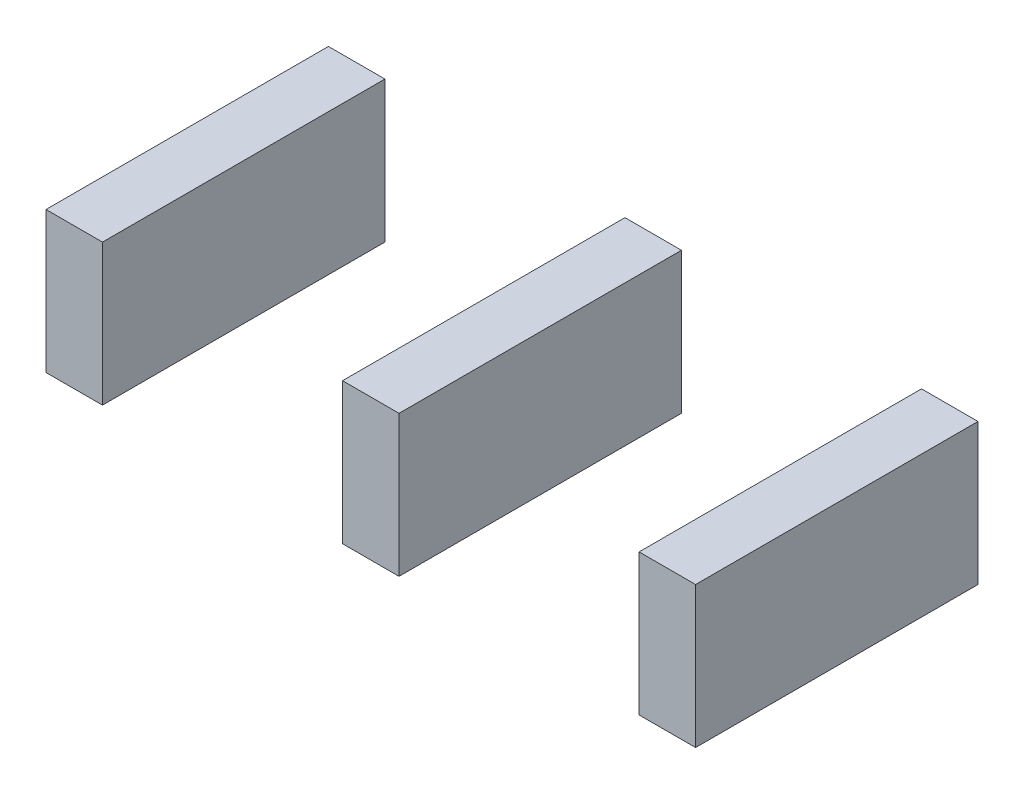
ISO-10303-21;
HEADER;
FILE_DESCRIPTION(('STEP AP214'),'2;1');
FILE_NAME('part.step','',(''),(''),'','','');
FILE_SCHEMA(('AUTOMOTIVE_DESIGN { 1 0 10303 214 1 1 1 1 }'));
ENDSEC;
DATA;
#1=APPLICATION_CONTEXT('core data for automotive mechanical design processes');
#2=APPLICATION_PROTOCOL_DEFINITION('international standard','automotive_design',2000,#1);
#3=PRODUCT_CONTEXT('',#1,'mechanical');
#4=PRODUCT('Part','Part','',(#3));
#5=PRODUCT_RELATED_PRODUCT_CATEGORY('part','',(#4));
#6=PRODUCT_DEFINITION_FORMATION('','',#4);
#7=PRODUCT_DEFINITION_CONTEXT('part definition',#1,'design');
#8=PRODUCT_DEFINITION('design','',#6,#7);
#9=PRODUCT_DEFINITION_SHAPE('','',#8);
#10=(LENGTH_UNIT() NAMED_UNIT(*) SI_UNIT(.MILLI.,.METRE.));
#11=(NAMED_UNIT(*) PLANE_ANGLE_UNIT() SI_UNIT($,.RADIAN.));
#12=(NAMED_UNIT(*) SI_UNIT($,.STERADIAN.) SOLID_ANGLE_UNIT());
#13=UNCERTAINTY_MEASURE_WITH_UNIT(LENGTH_MEASURE(1.E-05),#10,'distance_accuracy_value','');
#14=(GEOMETRIC_REPRESENTATION_CONTEXT(3) GLOBAL_UNCERTAINTY_ASSIGNED_CONTEXT((#13)) GLOBAL_UNIT_ASSIGNED_CONTEXT((#10,
#11,#12)) REPRESENTATION_CONTEXT('',''));
#15=CARTESIAN_POINT('',(0.,0.,0.));
#16=DIRECTION('',(0.,0.,1.));
#17=DIRECTION('',(1.,0.,0.));
#18=AXIS2_PLACEMENT_3D('',#15,#16,#17);
#19=CARTESIAN_POINT('',(3.8,1.,4.));
#20=DIRECTION('',(0.,-1.,0.));
#21=DIRECTION('',(0.,0.,-1.));
#22=AXIS2_PLACEMENT_3D('',#19,#20,#21);
#23=PLANE('',#22);
#24=DIRECTION('',(-1.,0.,0.));
#25=VECTOR('',#24,1.);
#26=CARTESIAN_POINT('',(3.8,1.,0.));
#27=LINE('',#26,#25);
#28=CARTESIAN_POINT('',(4.6,1.,0.));
#29=VERTEX_POINT('',#28);
#30=CARTESIAN_POINT('',(3.8,1.,0.));
#31=VERTEX_POINT('',#30);
#32=EDGE_CURVE('E107',#29,#31,#27,.T.);
#33=ORIENTED_EDGE('',*,*,#32,.T.);
#34=DIRECTION('',(0.,0.,-1.));
#35=VECTOR('',#34,1.);
#36=CARTESIAN_POINT('',(3.8,1.,4.));
#37=LINE('',#36,#35);
#38=CARTESIAN_POINT('',(3.8,1.,4.));
#39=VERTEX_POINT('',#38);
#40=EDGE_CURVE('E12',#39,#31,#37,.T.);
#41=ORIENTED_EDGE('',*,*,#40,.F.);
#42=DIRECTION('',(-1.,0.,0.));
#43=VECTOR('',#42,1.);
#44=CARTESIAN_POINT('',(3.8,1.,4.));
#45=LINE('',#44,#43);
#46=CARTESIAN_POINT('',(4.6,1.,4.));
#47=VERTEX_POINT('',#46);
#48=EDGE_CURVE('E95',#47,#39,#45,.T.);
#49=ORIENTED_EDGE('',*,*,#48,.F.);
#50=DIRECTION('',(0.,0.,-1.));
#51=VECTOR('',#50,1.);
#52=CARTESIAN_POINT('',(4.6,1.,4.));
#53=LINE('',#52,#51);
#54=EDGE_CURVE('E103',#47,#29,#53,.T.);
#55=ORIENTED_EDGE('',*,*,#54,.T.);
#56=EDGE_LOOP('',(#33,#41,#49,#55));
#57=FACE_BOUND('',#56,.T.);
#58=ADVANCED_FACE('F44',(#57),#23,.F.);
#59=CARTESIAN_POINT('',(3.8,1.,4.));
#60=DIRECTION('',(1.,0.,0.));
#61=DIRECTION('',(0.,1.,0.));
#62=AXIS2_PLACEMENT_3D('',#59,#60,#61);
#63=PLANE('',#62);
#64=DIRECTION('',(0.,-1.,0.));
#65=VECTOR('',#64,1.);
#66=CARTESIAN_POINT('',(3.8,1.,0.));
#67=LINE('',#66,#65);
#68=CARTESIAN_POINT('',(3.8,-1.,0.));
#69=VERTEX_POINT('',#68);
#70=EDGE_CURVE('E99',#31,#69,#67,.T.);
#71=ORIENTED_EDGE('',*,*,#70,.T.);
#72=DIRECTION('',(0.,0.,-1.));
#73=VECTOR('',#72,1.);
#74=CARTESIAN_POINT('',(3.8,-1.,4.));
#75=LINE('',#74,#73);
#76=CARTESIAN_POINT('',(3.8,-1.,4.));
#77=VERTEX_POINT('',#76);
#78=EDGE_CURVE('E52',#77,#69,#75,.T.);
#79=ORIENTED_EDGE('',*,*,#78,.F.);
#80=DIRECTION('',(0.,-1.,0.));
#81=VECTOR('',#80,1.);
#82=CARTESIAN_POINT('',(3.8,1.,4.));
#83=LINE('',#82,#81);
#84=EDGE_CURVE('E90',#39,#77,#83,.T.);
#85=ORIENTED_EDGE('',*,*,#84,.F.);
#86=ORIENTED_EDGE('',*,*,#40,.T.);
#87=EDGE_LOOP('',(#71,#79,#85,#86));
#88=FACE_BOUND('',#87,.T.);
#89=ADVANCED_FACE('F98',(#88),#63,.F.);
#90=CARTESIAN_POINT('',(3.8,-1.,4.));
#91=DIRECTION('',(0.,1.,0.));
#92=DIRECTION('',(0.,0.,1.));
#93=AXIS2_PLACEMENT_3D('',#90,#91,#92);
#94=PLANE('',#93);
#95=DIRECTION('',(1.,0.,0.));
#96=VECTOR('',#95,1.);
#97=CARTESIAN_POINT('',(3.8,-1.,0.));
#98=LINE('',#97,#96);
#99=CARTESIAN_POINT('',(4.6,-1.,0.));
#100=VERTEX_POINT('',#99);
#101=EDGE_CURVE('E77',#69,#100,#98,.T.);
#102=ORIENTED_EDGE('',*,*,#101,.T.);
#103=DIRECTION('',(0.,0.,-1.));
#104=VECTOR('',#103,1.);
#105=CARTESIAN_POINT('',(4.6,-1.,4.));
#106=LINE('',#105,#104);
#107=CARTESIAN_POINT('',(4.6,-1.,4.));
#108=VERTEX_POINT('',#107);
#109=EDGE_CURVE('E100',#108,#100,#106,.T.);
#110=ORIENTED_EDGE('',*,*,#109,.F.);
#111=DIRECTION('',(1.,0.,0.));
#112=VECTOR('',#111,1.);
#113=CARTESIAN_POINT('',(3.8,-1.,4.));
#114=LINE('',#113,#112);
#115=EDGE_CURVE('E93',#77,#108,#114,.T.);
#116=ORIENTED_EDGE('',*,*,#115,.F.);
#117=ORIENTED_EDGE('',*,*,#78,.T.);
#118=EDGE_LOOP('',(#102,#110,#116,#117));
#119=FACE_BOUND('',#118,.T.);
#120=ADVANCED_FACE('F101',(#119),#94,.F.);
#121=CARTESIAN_POINT('',(4.6,1.,4.));
#122=DIRECTION('',(-1.,0.,0.));
#123=DIRECTION('',(0.,-1.,0.));
#124=AXIS2_PLACEMENT_3D('',#121,#122,#123);
#125=PLANE('',#124);
#126=DIRECTION('',(0.,1.,0.));
#127=VECTOR('',#126,1.);
#128=CARTESIAN_POINT('',(4.6,1.,0.));
#129=LINE('',#128,#127);
#130=EDGE_CURVE('E83',#100,#29,#129,.T.);
#131=ORIENTED_EDGE('',*,*,#130,.T.);
#132=ORIENTED_EDGE('',*,*,#54,.F.);
#133=DIRECTION('',(0.,1.,0.));
#134=VECTOR('',#133,1.);
#135=CARTESIAN_POINT('',(4.6,1.,4.));
#136=LINE('',#135,#134);
#137=EDGE_CURVE('E60',#108,#47,#136,.T.);
#138=ORIENTED_EDGE('',*,*,#137,.F.);
#139=ORIENTED_EDGE('',*,*,#109,.T.);
#140=EDGE_LOOP('',(#131,#132,#138,#139));
#141=FACE_BOUND('',#140,.T.);
#142=ADVANCED_FACE('F114',(#141),#125,.F.);
#143=CARTESIAN_POINT('',(0.,0.,4.));
#144=DIRECTION('',(0.,0.,-1.));
#145=DIRECTION('',(-1.,0.,0.));
#146=AXIS2_PLACEMENT_3D('',#143,#144,#145);
#147=PLANE('',#146);
#148=ORIENTED_EDGE('',*,*,#48,.T.);
#149=ORIENTED_EDGE('',*,*,#84,.T.);
#150=ORIENTED_EDGE('',*,*,#115,.T.);
#151=ORIENTED_EDGE('',*,*,#137,.T.);
#152=EDGE_LOOP('',(#148,#149,#150,#151));
#153=FACE_BOUND('',#152,.T.);
#154=ADVANCED_FACE('F91',(#153),#147,.F.);
#155=CARTESIAN_POINT('',(0.,0.,0.));
#156=DIRECTION('',(0.,0.,-1.));
#157=DIRECTION('',(-1.,0.,0.));
#158=AXIS2_PLACEMENT_3D('',#155,#156,#157);
#159=PLANE('',#158);
#160=ORIENTED_EDGE('',*,*,#32,.F.);
#161=ORIENTED_EDGE('',*,*,#130,.F.);
#162=ORIENTED_EDGE('',*,*,#101,.F.);
#163=ORIENTED_EDGE('',*,*,#70,.F.);
#164=EDGE_LOOP('',(#160,#161,#162,#163));
#165=FACE_BOUND('',#164,.T.);
#166=ADVANCED_FACE('F117',(#165),#159,.T.);
#167=CLOSED_SHELL('',(#58,#89,#120,#142,#154,#166));
#168=MANIFOLD_SOLID_BREP('B2',#167);
#169=CARTESIAN_POINT('',(-4.6,0.999999999999971,4.));
#170=DIRECTION('',(0.,-1.,0.));
#171=DIRECTION('',(0.,0.,-1.));
#172=AXIS2_PLACEMENT_3D('',#169,#170,#171);
#173=PLANE('',#172);
#174=DIRECTION('',(-1.,0.,0.));
#175=VECTOR('',#174,1.);
#176=CARTESIAN_POINT('',(-4.6,0.999999999999971,0.));
#177=LINE('',#176,#175);
#178=CARTESIAN_POINT('',(-3.8,0.999999999999971,0.));
#179=VERTEX_POINT('',#178);
#180=CARTESIAN_POINT('',(-4.6,0.999999999999971,0.));
#181=VERTEX_POINT('',#180);
#182=EDGE_CURVE('E240',#179,#181,#177,.T.);
#183=ORIENTED_EDGE('',*,*,#182,.T.);
#184=DIRECTION('',(0.,0.,-1.));
#185=VECTOR('',#184,1.);
#186=CARTESIAN_POINT('',(-4.6,0.999999999999971,4.));
#187=LINE('',#186,#185);
#188=CARTESIAN_POINT('',(-4.6,0.999999999999971,4.));
#189=VERTEX_POINT('',#188);
#190=EDGE_CURVE('E42',#189,#181,#187,.T.);
#191=ORIENTED_EDGE('',*,*,#190,.F.);
#192=DIRECTION('',(-1.,0.,0.));
#193=VECTOR('',#192,1.);
#194=CARTESIAN_POINT('',(-4.6,0.999999999999971,4.));
#195=LINE('',#194,#193);
#196=CARTESIAN_POINT('',(-3.8,0.999999999999971,4.));
#197=VERTEX_POINT('',#196);
#198=EDGE_CURVE('E228',#197,#189,#195,.T.);
#199=ORIENTED_EDGE('',*,*,#198,.F.);
#200=DIRECTION('',(0.,0.,-1.));
#201=VECTOR('',#200,1.);
#202=CARTESIAN_POINT('',(-3.8,0.999999999999971,4.));
#203=LINE('',#202,#201);
#204=EDGE_CURVE('E236',#197,#179,#203,.T.);
#205=ORIENTED_EDGE('',*,*,#204,.T.);
#206=EDGE_LOOP('',(#183,#191,#199,#205));
#207=FACE_BOUND('',#206,.T.);
#208=ADVANCED_FACE('F177',(#207),#173,.F.);
#209=CARTESIAN_POINT('',(-4.6,0.999999999999971,4.));
#210=DIRECTION('',(1.,0.,0.));
#211=DIRECTION('',(0.,1.,0.));
#212=AXIS2_PLACEMENT_3D('',#209,#210,#211);
#213=PLANE('',#212);
#214=DIRECTION('',(0.,-1.,0.));
#215=VECTOR('',#214,1.);
#216=CARTESIAN_POINT('',(-4.6,0.999999999999971,0.));
#217=LINE('',#216,#215);
#218=CARTESIAN_POINT('',(-4.6,-1.00000000000003,0.));
#219=VERTEX_POINT('',#218);
#220=EDGE_CURVE('E232',#181,#219,#217,.T.);
#221=ORIENTED_EDGE('',*,*,#220,.T.);
#222=DIRECTION('',(0.,0.,-1.));
#223=VECTOR('',#222,1.);
#224=CARTESIAN_POINT('',(-4.6,-1.00000000000003,4.));
#225=LINE('',#224,#223);
#226=CARTESIAN_POINT('',(-4.6,-1.00000000000003,4.));
#227=VERTEX_POINT('',#226);
#228=EDGE_CURVE('E185',#227,#219,#225,.T.);
#229=ORIENTED_EDGE('',*,*,#228,.F.);
#230=DIRECTION('',(0.,-1.,0.));
#231=VECTOR('',#230,1.);
#232=CARTESIAN_POINT('',(-4.6,0.999999999999971,4.));
#233=LINE('',#232,#231);
#234=EDGE_CURVE('E223',#189,#227,#233,.T.);
#235=ORIENTED_EDGE('',*,*,#234,.F.);
#236=ORIENTED_EDGE('',*,*,#190,.T.);
#237=EDGE_LOOP('',(#221,#229,#235,#236));
#238=FACE_BOUND('',#237,.T.);
#239=ADVANCED_FACE('F231',(#238),#213,.F.);
#240=CARTESIAN_POINT('',(-4.6,-1.00000000000003,4.));
#241=DIRECTION('',(0.,1.,0.));
#242=DIRECTION('',(0.,0.,1.));
#243=AXIS2_PLACEMENT_3D('',#240,#241,#242);
#244=PLANE('',#243);
#245=DIRECTION('',(1.,0.,0.));
#246=VECTOR('',#245,1.);
#247=CARTESIAN_POINT('',(-4.6,-1.00000000000003,0.));
#248=LINE('',#247,#246);
#249=CARTESIAN_POINT('',(-3.8,-1.00000000000003,0.));
#250=VERTEX_POINT('',#249);
#251=EDGE_CURVE('E210',#219,#250,#248,.T.);
#252=ORIENTED_EDGE('',*,*,#251,.T.);
#253=DIRECTION('',(0.,0.,-1.));
#254=VECTOR('',#253,1.);
#255=CARTESIAN_POINT('',(-3.8,-1.00000000000003,4.));
#256=LINE('',#255,#254);
#257=CARTESIAN_POINT('',(-3.8,-1.00000000000003,4.));
#258=VERTEX_POINT('',#257);
#259=EDGE_CURVE('E233',#258,#250,#256,.T.);
#260=ORIENTED_EDGE('',*,*,#259,.F.);
#261=DIRECTION('',(1.,0.,0.));
#262=VECTOR('',#261,1.);
#263=CARTESIAN_POINT('',(-4.6,-1.00000000000003,4.));
#264=LINE('',#263,#262);
#265=EDGE_CURVE('E226',#227,#258,#264,.T.);
#266=ORIENTED_EDGE('',*,*,#265,.F.);
#267=ORIENTED_EDGE('',*,*,#228,.T.);
#268=EDGE_LOOP('',(#252,#260,#266,#267));
#269=FACE_BOUND('',#268,.T.);
#270=ADVANCED_FACE('F234',(#269),#244,.F.);
#271=CARTESIAN_POINT('',(-3.8,0.999999999999971,4.));
#272=DIRECTION('',(-1.,0.,0.));
#273=DIRECTION('',(0.,-1.,0.));
#274=AXIS2_PLACEMENT_3D('',#271,#272,#273);
#275=PLANE('',#274);
#276=DIRECTION('',(0.,1.,0.));
#277=VECTOR('',#276,1.);
#278=CARTESIAN_POINT('',(-3.8,0.999999999999971,0.));
#279=LINE('',#278,#277);
#280=EDGE_CURVE('E216',#250,#179,#279,.T.);
#281=ORIENTED_EDGE('',*,*,#280,.T.);
#282=ORIENTED_EDGE('',*,*,#204,.F.);
#283=DIRECTION('',(0.,1.,0.));
#284=VECTOR('',#283,1.);
#285=CARTESIAN_POINT('',(-3.8,0.999999999999971,4.));
#286=LINE('',#285,#284);
#287=EDGE_CURVE('E193',#258,#197,#286,.T.);
#288=ORIENTED_EDGE('',*,*,#287,.F.);
#289=ORIENTED_EDGE('',*,*,#259,.T.);
#290=EDGE_LOOP('',(#281,#282,#288,#289));
#291=FACE_BOUND('',#290,.T.);
#292=ADVANCED_FACE('F247',(#291),#275,.F.);
#293=CARTESIAN_POINT('',(0.,0.,4.));
#294=DIRECTION('',(0.,0.,-1.));
#295=DIRECTION('',(-1.,0.,0.));
#296=AXIS2_PLACEMENT_3D('',#293,#294,#295);
#297=PLANE('',#296);
#298=ORIENTED_EDGE('',*,*,#198,.T.);
#299=ORIENTED_EDGE('',*,*,#234,.T.);
#300=ORIENTED_EDGE('',*,*,#265,.T.);
#301=ORIENTED_EDGE('',*,*,#287,.T.);
#302=EDGE_LOOP('',(#298,#299,#300,#301));
#303=FACE_BOUND('',#302,.T.);
#304=ADVANCED_FACE('F224',(#303),#297,.F.);
#305=CARTESIAN_POINT('',(0.,0.,0.));
#306=DIRECTION('',(0.,0.,-1.));
#307=DIRECTION('',(-1.,0.,0.));
#308=AXIS2_PLACEMENT_3D('',#305,#306,#307);
#309=PLANE('',#308);
#310=ORIENTED_EDGE('',*,*,#182,.F.);
#311=ORIENTED_EDGE('',*,*,#280,.F.);
#312=ORIENTED_EDGE('',*,*,#251,.F.);
#313=ORIENTED_EDGE('',*,*,#220,.F.);
#314=EDGE_LOOP('',(#310,#311,#312,#313));
#315=FACE_BOUND('',#314,.T.);
#316=ADVANCED_FACE('F250',(#315),#309,.T.);
#317=CLOSED_SHELL('',(#208,#239,#270,#292,#304,#316));
#318=MANIFOLD_SOLID_BREP('B6',#317);
#319=CARTESIAN_POINT('',(-0.399999999999999,1.,4.));
#320=DIRECTION('',(1.,0.,0.));
#321=DIRECTION('',(0.,1.,0.));
#322=AXIS2_PLACEMENT_3D('',#319,#320,#321);
#323=PLANE('',#322);
#324=DIRECTION('',(0.,-1.,0.));
#325=VECTOR('',#324,1.);
#326=CARTESIAN_POINT('',(-0.399999999999999,1.,0.));
#327=LINE('',#326,#325);
#328=CARTESIAN_POINT('',(-0.399999999999999,1.,0.));
#329=VERTEX_POINT('',#328);
#330=CARTESIAN_POINT('',(-0.4,-1.,0.));
#331=VERTEX_POINT('',#330);
#332=EDGE_CURVE('E364',#329,#331,#327,.T.);
#333=ORIENTED_EDGE('',*,*,#332,.T.);
#334=DIRECTION('',(0.,0.,-1.));
#335=VECTOR('',#334,1.);
#336=CARTESIAN_POINT('',(-0.4,-1.,4.));
#337=LINE('',#336,#335);
#338=CARTESIAN_POINT('',(-0.4,-1.,4.));
#339=VERTEX_POINT('',#338);
#340=EDGE_CURVE('E175',#339,#331,#337,.T.);
#341=ORIENTED_EDGE('',*,*,#340,.F.);
#342=DIRECTION('',(0.,-1.,0.));
#343=VECTOR('',#342,1.);
#344=CARTESIAN_POINT('',(-0.399999999999999,1.,4.));
#345=LINE('',#344,#343);
#346=CARTESIAN_POINT('',(-0.399999999999999,1.,4.));
#347=VERTEX_POINT('',#346);
#348=EDGE_CURVE('E352',#347,#339,#345,.T.);
#349=ORIENTED_EDGE('',*,*,#348,.F.);
#350=DIRECTION('',(0.,0.,-1.));
#351=VECTOR('',#350,1.);
#352=CARTESIAN_POINT('',(-0.399999999999999,1.,4.));
#353=LINE('',#352,#351);
#354=EDGE_CURVE('E360',#347,#329,#353,.T.);
#355=ORIENTED_EDGE('',*,*,#354,.T.);
#356=EDGE_LOOP('',(#333,#341,#349,#355));
#357=FACE_BOUND('',#356,.T.);
#358=ADVANCED_FACE('F301',(#357),#323,.F.);
#359=CARTESIAN_POINT('',(-0.4,-1.,4.));
#360=DIRECTION('',(0.,1.,0.));
#361=DIRECTION('',(0.,0.,1.));
#362=AXIS2_PLACEMENT_3D('',#359,#360,#361);
#363=PLANE('',#362);
#364=DIRECTION('',(1.,0.,0.));
#365=VECTOR('',#364,1.);
#366=CARTESIAN_POINT('',(-0.4,-1.,0.));
#367=LINE('',#366,#365);
#368=CARTESIAN_POINT('',(0.4,-1.,0.));
#369=VERTEX_POINT('',#368);
#370=EDGE_CURVE('E356',#331,#369,#367,.T.);
#371=ORIENTED_EDGE('',*,*,#370,.T.);
#372=DIRECTION('',(0.,0.,-1.));
#373=VECTOR('',#372,1.);
#374=CARTESIAN_POINT('',(0.4,-1.,4.));
#375=LINE('',#374,#373);
#376=CARTESIAN_POINT('',(0.4,-1.,4.));
#377=VERTEX_POINT('',#376);
#378=EDGE_CURVE('E309',#377,#369,#375,.T.);
#379=ORIENTED_EDGE('',*,*,#378,.F.);
#380=DIRECTION('',(1.,0.,0.));
#381=VECTOR('',#380,1.);
#382=CARTESIAN_POINT('',(-0.4,-1.,4.));
#383=LINE('',#382,#381);
#384=EDGE_CURVE('E347',#339,#377,#383,.T.);
#385=ORIENTED_EDGE('',*,*,#384,.F.);
#386=ORIENTED_EDGE('',*,*,#340,.T.);
#387=EDGE_LOOP('',(#371,#379,#385,#386));
#388=FACE_BOUND('',#387,.T.);
#389=ADVANCED_FACE('F355',(#388),#363,.F.);
#390=CARTESIAN_POINT('',(0.399999999999999,1.,4.));
#391=DIRECTION('',(-1.,0.,0.));
#392=DIRECTION('',(0.,-1.,0.));
#393=AXIS2_PLACEMENT_3D('',#390,#391,#392);
#394=PLANE('',#393);
#395=DIRECTION('',(0.,1.,0.));
#396=VECTOR('',#395,1.);
#397=CARTESIAN_POINT('',(0.399999999999999,1.,0.));
#398=LINE('',#397,#396);
#399=CARTESIAN_POINT('',(0.399999999999999,1.,0.));
#400=VERTEX_POINT('',#399);
#401=EDGE_CURVE('E334',#369,#400,#398,.T.);
#402=ORIENTED_EDGE('',*,*,#401,.T.);
#403=DIRECTION('',(0.,0.,-1.));
#404=VECTOR('',#403,1.);
#405=CARTESIAN_POINT('',(0.399999999999999,1.,4.));
#406=LINE('',#405,#404);
#407=CARTESIAN_POINT('',(0.399999999999999,1.,4.));
#408=VERTEX_POINT('',#407);
#409=EDGE_CURVE('E357',#408,#400,#406,.T.);
#410=ORIENTED_EDGE('',*,*,#409,.F.);
#411=DIRECTION('',(0.,1.,0.));
#412=VECTOR('',#411,1.);
#413=CARTESIAN_POINT('',(0.399999999999999,1.,4.));
#414=LINE('',#413,#412);
#415=EDGE_CURVE('E350',#377,#408,#414,.T.);
#416=ORIENTED_EDGE('',*,*,#415,.F.);
#417=ORIENTED_EDGE('',*,*,#378,.T.);
#418=EDGE_LOOP('',(#402,#410,#416,#417));
#419=FACE_BOUND('',#418,.T.);
#420=ADVANCED_FACE('F358',(#419),#394,.F.);
#421=CARTESIAN_POINT('',(-0.399999999999999,1.,4.));
#422=DIRECTION('',(0.,-1.,0.));
#423=DIRECTION('',(0.,0.,-1.));
#424=AXIS2_PLACEMENT_3D('',#421,#422,#423);
#425=PLANE('',#424);
#426=DIRECTION('',(-1.,0.,0.));
#427=VECTOR('',#426,1.);
#428=CARTESIAN_POINT('',(-0.399999999999999,1.,0.));
#429=LINE('',#428,#427);
#430=EDGE_CURVE('E340',#400,#329,#429,.T.);
#431=ORIENTED_EDGE('',*,*,#430,.T.);
#432=ORIENTED_EDGE('',*,*,#354,.F.);
#433=DIRECTION('',(-1.,0.,0.));
#434=VECTOR('',#433,1.);
#435=CARTESIAN_POINT('',(-0.399999999999999,1.,4.));
#436=LINE('',#435,#434);
#437=EDGE_CURVE('E317',#408,#347,#436,.T.);
#438=ORIENTED_EDGE('',*,*,#437,.F.);
#439=ORIENTED_EDGE('',*,*,#409,.T.);
#440=EDGE_LOOP('',(#431,#432,#438,#439));
#441=FACE_BOUND('',#440,.T.);
#442=ADVANCED_FACE('F371',(#441),#425,.F.);
#443=CARTESIAN_POINT('',(0.,0.,4.));
#444=DIRECTION('',(0.,0.,1.));
#445=DIRECTION('',(1.,0.,0.));
#446=AXIS2_PLACEMENT_3D('',#443,#444,#445);
#447=PLANE('',#446);
#448=ORIENTED_EDGE('',*,*,#348,.T.);
#449=ORIENTED_EDGE('',*,*,#384,.T.);
#450=ORIENTED_EDGE('',*,*,#415,.T.);
#451=ORIENTED_EDGE('',*,*,#437,.T.);
#452=EDGE_LOOP('',(#448,#449,#450,#451));
#453=FACE_BOUND('',#452,.T.);
#454=ADVANCED_FACE('F348',(#453),#447,.T.);
#455=CARTESIAN_POINT('',(0.,0.,0.));
#456=DIRECTION('',(0.,0.,1.));
#457=DIRECTION('',(1.,0.,0.));
#458=AXIS2_PLACEMENT_3D('',#455,#456,#457);
#459=PLANE('',#458);
#460=ORIENTED_EDGE('',*,*,#332,.F.);
#461=ORIENTED_EDGE('',*,*,#430,.F.);
#462=ORIENTED_EDGE('',*,*,#401,.F.);
#463=ORIENTED_EDGE('',*,*,#370,.F.);
#464=EDGE_LOOP('',(#460,#461,#462,#463));
#465=FACE_BOUND('',#464,.T.);
#466=ADVANCED_FACE('F374',(#465),#459,.F.);
#467=CLOSED_SHELL('',(#358,#389,#420,#442,#454,#466));
#468=MANIFOLD_SOLID_BREP('B36',#467);
#469=ADVANCED_BREP_SHAPE_REPRESENTATION('',(#18,#168,#318,#468),#14);
#470=SHAPE_DEFINITION_REPRESENTATION(#9,#469);
ENDSEC;
END-ISO-10303-21;
